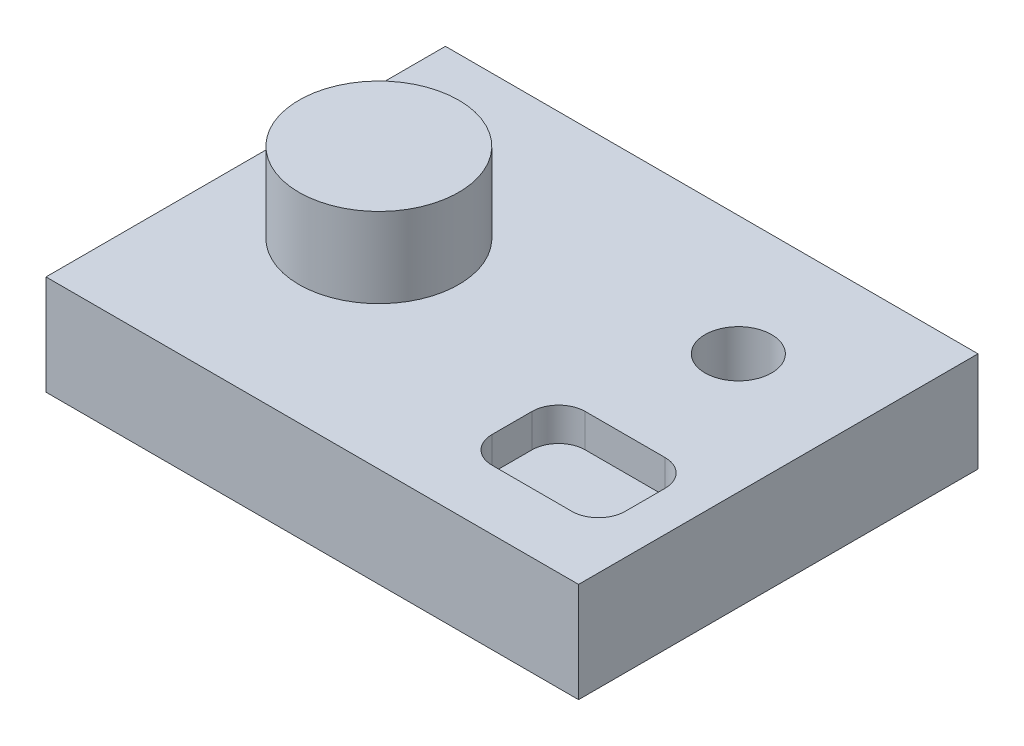
ISO-10303-21;
HEADER;
FILE_DESCRIPTION(('STEP AP214'),'2;1');
FILE_NAME('part.step','',(''),(''),'','','');
FILE_SCHEMA(('AUTOMOTIVE_DESIGN { 1 0 10303 214 1 1 1 1 }'));
ENDSEC;
DATA;
#1=APPLICATION_CONTEXT('core data for automotive mechanical design processes');
#2=APPLICATION_PROTOCOL_DEFINITION('international standard','automotive_design',2000,#1);
#3=PRODUCT_CONTEXT('',#1,'mechanical');
#4=PRODUCT('Part','Part','',(#3));
#5=PRODUCT_RELATED_PRODUCT_CATEGORY('part','',(#4));
#6=PRODUCT_DEFINITION_FORMATION('','',#4);
#7=PRODUCT_DEFINITION_CONTEXT('part definition',#1,'design');
#8=PRODUCT_DEFINITION('design','',#6,#7);
#9=PRODUCT_DEFINITION_SHAPE('','',#8);
#10=(LENGTH_UNIT() NAMED_UNIT(*) SI_UNIT(.MILLI.,.METRE.));
#11=(NAMED_UNIT(*) PLANE_ANGLE_UNIT() SI_UNIT($,.RADIAN.));
#12=(NAMED_UNIT(*) SI_UNIT($,.STERADIAN.) SOLID_ANGLE_UNIT());
#13=UNCERTAINTY_MEASURE_WITH_UNIT(LENGTH_MEASURE(1.E-05),#10,'distance_accuracy_value','');
#14=(GEOMETRIC_REPRESENTATION_CONTEXT(3) GLOBAL_UNCERTAINTY_ASSIGNED_CONTEXT((#13)) GLOBAL_UNIT_ASSIGNED_CONTEXT((#10,
#11,#12)) REPRESENTATION_CONTEXT('',''));
#15=CARTESIAN_POINT('',(0.,0.,0.));
#16=DIRECTION('',(0.,0.,1.));
#17=DIRECTION('',(1.,0.,0.));
#18=AXIS2_PLACEMENT_3D('',#15,#16,#17);
#19=CARTESIAN_POINT('',(-40.,15.,30.));
#20=DIRECTION('',(1.,0.,0.));
#21=DIRECTION('',(0.,0.,-1.));
#22=AXIS2_PLACEMENT_3D('',#19,#20,#21);
#23=PLANE('',#22);
#24=DIRECTION('',(0.,0.,1.));
#25=VECTOR('',#24,1.);
#26=CARTESIAN_POINT('',(-40.,0.,30.));
#27=LINE('',#26,#25);
#28=CARTESIAN_POINT('',(-40.,0.,-30.));
#29=VERTEX_POINT('',#28);
#30=CARTESIAN_POINT('',(-40.,0.,30.));
#31=VERTEX_POINT('',#30);
#32=EDGE_CURVE('E217',#29,#31,#27,.T.);
#33=ORIENTED_EDGE('',*,*,#32,.T.);
#34=DIRECTION('',(0.,-1.,0.));
#35=VECTOR('',#34,1.);
#36=CARTESIAN_POINT('',(-40.,15.,30.));
#37=LINE('',#36,#35);
#38=CARTESIAN_POINT('',(-40.,15.,30.));
#39=VERTEX_POINT('',#38);
#40=EDGE_CURVE('E42',#39,#31,#37,.T.);
#41=ORIENTED_EDGE('',*,*,#40,.F.);
#42=DIRECTION('',(0.,0.,1.));
#43=VECTOR('',#42,1.);
#44=CARTESIAN_POINT('',(-40.,15.,30.));
#45=LINE('',#44,#43);
#46=CARTESIAN_POINT('',(-40.,15.,-30.));
#47=VERTEX_POINT('',#46);
#48=EDGE_CURVE('E219',#47,#39,#45,.T.);
#49=ORIENTED_EDGE('',*,*,#48,.F.);
#50=DIRECTION('',(0.,-1.,0.));
#51=VECTOR('',#50,1.);
#52=CARTESIAN_POINT('',(-40.,15.,-30.));
#53=LINE('',#52,#51);
#54=EDGE_CURVE('E229',#47,#29,#53,.T.);
#55=ORIENTED_EDGE('',*,*,#54,.T.);
#56=EDGE_LOOP('',(#33,#41,#49,#55));
#57=FACE_BOUND('',#56,.T.);
#58=ADVANCED_FACE('F41',(#57),#23,.F.);
#59=CARTESIAN_POINT('',(-40.,15.,30.));
#60=DIRECTION('',(0.,0.,-1.));
#61=DIRECTION('',(-1.,0.,0.));
#62=AXIS2_PLACEMENT_3D('',#59,#60,#61);
#63=PLANE('',#62);
#64=DIRECTION('',(1.,0.,0.));
#65=VECTOR('',#64,1.);
#66=CARTESIAN_POINT('',(-40.,0.,30.));
#67=LINE('',#66,#65);
#68=CARTESIAN_POINT('',(40.,0.,30.));
#69=VERTEX_POINT('',#68);
#70=EDGE_CURVE('E228',#31,#69,#67,.T.);
#71=ORIENTED_EDGE('',*,*,#70,.T.);
#72=DIRECTION('',(0.,-1.,0.));
#73=VECTOR('',#72,1.);
#74=CARTESIAN_POINT('',(40.,15.,30.));
#75=LINE('',#74,#73);
#76=CARTESIAN_POINT('',(40.,15.,30.));
#77=VERTEX_POINT('',#76);
#78=EDGE_CURVE('E237',#77,#69,#75,.T.);
#79=ORIENTED_EDGE('',*,*,#78,.F.);
#80=DIRECTION('',(1.,0.,0.));
#81=VECTOR('',#80,1.);
#82=CARTESIAN_POINT('',(-40.,15.,30.));
#83=LINE('',#82,#81);
#84=EDGE_CURVE('E94',#39,#77,#83,.T.);
#85=ORIENTED_EDGE('',*,*,#84,.F.);
#86=ORIENTED_EDGE('',*,*,#40,.T.);
#87=EDGE_LOOP('',(#71,#79,#85,#86));
#88=FACE_BOUND('',#87,.T.);
#89=ADVANCED_FACE('F241',(#88),#63,.F.);
#90=CARTESIAN_POINT('',(40.,15.,30.));
#91=DIRECTION('',(-1.,0.,0.));
#92=DIRECTION('',(0.,0.,1.));
#93=AXIS2_PLACEMENT_3D('',#90,#91,#92);
#94=PLANE('',#93);
#95=DIRECTION('',(0.,0.,-1.));
#96=VECTOR('',#95,1.);
#97=CARTESIAN_POINT('',(40.,0.,30.));
#98=LINE('',#97,#96);
#99=CARTESIAN_POINT('',(40.,0.,-30.));
#100=VERTEX_POINT('',#99);
#101=EDGE_CURVE('E232',#69,#100,#98,.T.);
#102=ORIENTED_EDGE('',*,*,#101,.T.);
#103=DIRECTION('',(0.,-1.,0.));
#104=VECTOR('',#103,1.);
#105=CARTESIAN_POINT('',(40.,15.,-30.));
#106=LINE('',#105,#104);
#107=CARTESIAN_POINT('',(40.,15.,-30.));
#108=VERTEX_POINT('',#107);
#109=EDGE_CURVE('E231',#108,#100,#106,.T.);
#110=ORIENTED_EDGE('',*,*,#109,.F.);
#111=DIRECTION('',(0.,0.,-1.));
#112=VECTOR('',#111,1.);
#113=CARTESIAN_POINT('',(40.,15.,30.));
#114=LINE('',#113,#112);
#115=EDGE_CURVE('E224',#77,#108,#114,.T.);
#116=ORIENTED_EDGE('',*,*,#115,.F.);
#117=ORIENTED_EDGE('',*,*,#78,.T.);
#118=EDGE_LOOP('',(#102,#110,#116,#117));
#119=FACE_BOUND('',#118,.T.);
#120=ADVANCED_FACE('F249',(#119),#94,.F.);
#121=CARTESIAN_POINT('',(-40.,15.,-30.));
#122=DIRECTION('',(0.,0.,1.));
#123=DIRECTION('',(1.,0.,0.));
#124=AXIS2_PLACEMENT_3D('',#121,#122,#123);
#125=PLANE('',#124);
#126=DIRECTION('',(-1.,0.,0.));
#127=VECTOR('',#126,1.);
#128=CARTESIAN_POINT('',(-40.,0.,-30.));
#129=LINE('',#128,#127);
#130=EDGE_CURVE('E88',#100,#29,#129,.T.);
#131=ORIENTED_EDGE('',*,*,#130,.T.);
#132=ORIENTED_EDGE('',*,*,#54,.F.);
#133=DIRECTION('',(-1.,0.,0.));
#134=VECTOR('',#133,1.);
#135=CARTESIAN_POINT('',(-40.,15.,-30.));
#136=LINE('',#135,#134);
#137=EDGE_CURVE('E62',#108,#47,#136,.T.);
#138=ORIENTED_EDGE('',*,*,#137,.F.);
#139=ORIENTED_EDGE('',*,*,#109,.T.);
#140=EDGE_LOOP('',(#131,#132,#138,#139));
#141=FACE_BOUND('',#140,.T.);
#142=ADVANCED_FACE('F246',(#141),#125,.F.);
#143=CARTESIAN_POINT('',(0.,15.,0.));
#144=DIRECTION('',(0.,-1.,0.));
#145=DIRECTION('',(0.,0.,-1.));
#146=AXIS2_PLACEMENT_3D('',#143,#144,#145);
#147=PLANE('',#146);
#148=DIRECTION('',(1.,0.,0.));
#149=VECTOR('',#148,1.);
#150=CARTESIAN_POINT('',(18.,15.,21.));
#151=LINE('',#150,#149);
#152=CARTESIAN_POINT('',(18.,15.,21.));
#153=VERTEX_POINT('',#152);
#154=CARTESIAN_POINT('',(30.,15.,21.));
#155=VERTEX_POINT('',#154);
#156=EDGE_CURVE('E182',#153,#155,#151,.T.);
#157=ORIENTED_EDGE('',*,*,#156,.F.);
#158=CARTESIAN_POINT('',(18.,15.,17.));
#159=DIRECTION('',(0.,1.,0.));
#160=DIRECTION('',(0.,0.,1.));
#161=AXIS2_PLACEMENT_3D('',#158,#159,#160);
#162=CIRCLE('',#161,4.);
#163=CARTESIAN_POINT('',(14.,15.,17.));
#164=VERTEX_POINT('',#163);
#165=EDGE_CURVE('E57',#164,#153,#162,.T.);
#166=ORIENTED_EDGE('',*,*,#165,.F.);
#167=DIRECTION('',(0.,0.,1.));
#168=VECTOR('',#167,1.);
#169=CARTESIAN_POINT('',(14.,15.,11.));
#170=LINE('',#169,#168);
#171=CARTESIAN_POINT('',(14.,15.,11.));
#172=VERTEX_POINT('',#171);
#173=EDGE_CURVE('E161',#172,#164,#170,.T.);
#174=ORIENTED_EDGE('',*,*,#173,.F.);
#175=CARTESIAN_POINT('',(18.,15.,11.));
#176=DIRECTION('',(0.,1.,0.));
#177=DIRECTION('',(0.,0.,1.));
#178=AXIS2_PLACEMENT_3D('',#175,#176,#177);
#179=CIRCLE('',#178,4.);
#180=CARTESIAN_POINT('',(18.,15.,7.));
#181=VERTEX_POINT('',#180);
#182=EDGE_CURVE('E163',#181,#172,#179,.T.);
#183=ORIENTED_EDGE('',*,*,#182,.F.);
#184=DIRECTION('',(-1.,0.,0.));
#185=VECTOR('',#184,1.);
#186=CARTESIAN_POINT('',(30.,15.,7.));
#187=LINE('',#186,#185);
#188=CARTESIAN_POINT('',(30.,15.,7.));
#189=VERTEX_POINT('',#188);
#190=EDGE_CURVE('E195',#189,#181,#187,.T.);
#191=ORIENTED_EDGE('',*,*,#190,.F.);
#192=CARTESIAN_POINT('',(30.,15.,11.));
#193=DIRECTION('',(0.,1.,0.));
#194=DIRECTION('',(0.,0.,1.));
#195=AXIS2_PLACEMENT_3D('',#192,#193,#194);
#196=CIRCLE('',#195,4.);
#197=CARTESIAN_POINT('',(34.,15.,11.));
#198=VERTEX_POINT('',#197);
#199=EDGE_CURVE('E188',#198,#189,#196,.T.);
#200=ORIENTED_EDGE('',*,*,#199,.F.);
#201=DIRECTION('',(0.,0.,-1.));
#202=VECTOR('',#201,1.);
#203=CARTESIAN_POINT('',(34.,15.,17.));
#204=LINE('',#203,#202);
#205=CARTESIAN_POINT('',(34.,15.,17.));
#206=VERTEX_POINT('',#205);
#207=EDGE_CURVE('E189',#206,#198,#204,.T.);
#208=ORIENTED_EDGE('',*,*,#207,.F.);
#209=CARTESIAN_POINT('',(30.,15.,17.));
#210=DIRECTION('',(0.,1.,0.));
#211=DIRECTION('',(0.,0.,1.));
#212=AXIS2_PLACEMENT_3D('',#209,#210,#211);
#213=CIRCLE('',#212,4.);
#214=EDGE_CURVE('E181',#155,#206,#213,.T.);
#215=ORIENTED_EDGE('',*,*,#214,.F.);
#216=EDGE_LOOP('',(#157,#166,#174,#183,#191,#200,#208,#215));
#217=FACE_BOUND('',#216,.T.);
#218=CARTESIAN_POINT('',(22.,15.,-12.));
#219=DIRECTION('',(0.,1.,0.));
#220=DIRECTION('',(0.,0.,1.));
#221=AXIS2_PLACEMENT_3D('',#218,#219,#220);
#222=CIRCLE('',#221,5.);
#223=CARTESIAN_POINT('',(22.,15.,-7.));
#224=VERTEX_POINT('',#223);
#225=EDGE_CURVE('E200',#224,#224,#222,.T.);
#226=ORIENTED_EDGE('',*,*,#225,.F.);
#227=EDGE_LOOP('',(#226));
#228=FACE_BOUND('',#227,.T.);
#229=CARTESIAN_POINT('',(-20.,15.,0.));
#230=DIRECTION('',(0.,1.,0.));
#231=DIRECTION('',(0.,0.,1.));
#232=AXIS2_PLACEMENT_3D('',#229,#230,#231);
#233=CIRCLE('',#232,12.);
#234=CARTESIAN_POINT('',(-20.,15.,12.));
#235=VERTEX_POINT('',#234);
#236=EDGE_CURVE('E11',#235,#235,#233,.T.);
#237=ORIENTED_EDGE('',*,*,#236,.F.);
#238=EDGE_LOOP('',(#237));
#239=FACE_BOUND('',#238,.T.);
#240=ORIENTED_EDGE('',*,*,#48,.T.);
#241=ORIENTED_EDGE('',*,*,#84,.T.);
#242=ORIENTED_EDGE('',*,*,#115,.T.);
#243=ORIENTED_EDGE('',*,*,#137,.T.);
#244=EDGE_LOOP('',(#240,#241,#242,#243));
#245=FACE_BOUND('',#244,.T.);
#246=ADVANCED_FACE('F253',(#217,#228,#239,#245),#147,.F.);
#247=CARTESIAN_POINT('',(0.,0.,0.));
#248=DIRECTION('',(0.,-1.,0.));
#249=DIRECTION('',(0.,0.,-1.));
#250=AXIS2_PLACEMENT_3D('',#247,#248,#249);
#251=PLANE('',#250);
#252=ORIENTED_EDGE('',*,*,#32,.F.);
#253=ORIENTED_EDGE('',*,*,#130,.F.);
#254=ORIENTED_EDGE('',*,*,#101,.F.);
#255=ORIENTED_EDGE('',*,*,#70,.F.);
#256=EDGE_LOOP('',(#252,#253,#254,#255));
#257=FACE_BOUND('',#256,.T.);
#258=ADVANCED_FACE('F250',(#257),#251,.T.);
#259=CARTESIAN_POINT('',(-20.,27.,0.));
#260=DIRECTION('',(0.,-1.,0.));
#261=DIRECTION('',(0.,0.,-1.));
#262=AXIS2_PLACEMENT_3D('',#259,#260,#261);
#263=CYLINDRICAL_SURFACE('',#262,12.);
#264=CARTESIAN_POINT('',(-20.,27.,0.));
#265=DIRECTION('',(0.,1.,0.));
#266=DIRECTION('',(0.,0.,1.));
#267=AXIS2_PLACEMENT_3D('',#264,#265,#266);
#268=CIRCLE('',#267,12.);
#269=CARTESIAN_POINT('',(-20.,27.,12.));
#270=VERTEX_POINT('',#269);
#271=EDGE_CURVE('E212',#270,#270,#268,.T.);
#272=ORIENTED_EDGE('',*,*,#271,.F.);
#273=EDGE_LOOP('',(#272));
#274=FACE_BOUND('',#273,.T.);
#275=ORIENTED_EDGE('',*,*,#236,.T.);
#276=EDGE_LOOP('',(#275));
#277=FACE_BOUND('',#276,.T.);
#278=ADVANCED_FACE('F257',(#274,#277),#263,.T.);
#279=CARTESIAN_POINT('',(-20.,27.,0.));
#280=DIRECTION('',(0.,1.,0.));
#281=DIRECTION('',(0.,0.,1.));
#282=AXIS2_PLACEMENT_3D('',#279,#280,#281);
#283=PLANE('',#282);
#284=ORIENTED_EDGE('',*,*,#271,.T.);
#285=EDGE_LOOP('',(#284));
#286=FACE_BOUND('',#285,.T.);
#287=ADVANCED_FACE('F291',(#286),#283,.T.);
#288=CARTESIAN_POINT('',(22.,5.,-12.));
#289=DIRECTION('',(0.,1.,0.));
#290=DIRECTION('',(0.,0.,1.));
#291=AXIS2_PLACEMENT_3D('',#288,#289,#290);
#292=CYLINDRICAL_SURFACE('',#291,5.);
#293=CARTESIAN_POINT('',(22.,5.,-12.));
#294=DIRECTION('',(0.,1.,0.));
#295=DIRECTION('',(0.,0.,1.));
#296=AXIS2_PLACEMENT_3D('',#293,#294,#295);
#297=CIRCLE('',#296,5.);
#298=CARTESIAN_POINT('',(22.,5.,-7.));
#299=VERTEX_POINT('',#298);
#300=EDGE_CURVE('E211',#299,#299,#297,.T.);
#301=ORIENTED_EDGE('',*,*,#300,.F.);
#302=EDGE_LOOP('',(#301));
#303=FACE_BOUND('',#302,.T.);
#304=ORIENTED_EDGE('',*,*,#225,.T.);
#305=EDGE_LOOP('',(#304));
#306=FACE_BOUND('',#305,.T.);
#307=ADVANCED_FACE('F302',(#303,#306),#292,.F.);
#308=CARTESIAN_POINT('',(22.,5.,-12.));
#309=DIRECTION('',(0.,1.,0.));
#310=DIRECTION('',(0.,0.,1.));
#311=AXIS2_PLACEMENT_3D('',#308,#309,#310);
#312=PLANE('',#311);
#313=ORIENTED_EDGE('',*,*,#300,.T.);
#314=EDGE_LOOP('',(#313));
#315=FACE_BOUND('',#314,.T.);
#316=ADVANCED_FACE('F310',(#315),#312,.T.);
#317=CARTESIAN_POINT('',(18.,10.,17.));
#318=DIRECTION('',(0.,1.,0.));
#319=DIRECTION('',(0.,0.,1.));
#320=AXIS2_PLACEMENT_3D('',#317,#318,#319);
#321=CYLINDRICAL_SURFACE('',#320,4.);
#322=ORIENTED_EDGE('',*,*,#165,.T.);
#323=DIRECTION('',(0.,1.,0.));
#324=VECTOR('',#323,1.);
#325=CARTESIAN_POINT('',(18.,10.,21.));
#326=LINE('',#325,#324);
#327=CARTESIAN_POINT('',(18.,10.,21.));
#328=VERTEX_POINT('',#327);
#329=EDGE_CURVE('E138',#328,#153,#326,.T.);
#330=ORIENTED_EDGE('',*,*,#329,.F.);
#331=CARTESIAN_POINT('',(18.,10.,17.));
#332=DIRECTION('',(0.,1.,0.));
#333=DIRECTION('',(0.,0.,1.));
#334=AXIS2_PLACEMENT_3D('',#331,#332,#333);
#335=CIRCLE('',#334,4.);
#336=CARTESIAN_POINT('',(14.,10.,17.));
#337=VERTEX_POINT('',#336);
#338=EDGE_CURVE('E142',#337,#328,#335,.T.);
#339=ORIENTED_EDGE('',*,*,#338,.F.);
#340=DIRECTION('',(0.,1.,0.));
#341=VECTOR('',#340,1.);
#342=CARTESIAN_POINT('',(14.,10.,17.));
#343=LINE('',#342,#341);
#344=EDGE_CURVE('E197',#337,#164,#343,.T.);
#345=ORIENTED_EDGE('',*,*,#344,.T.);
#346=EDGE_LOOP('',(#322,#330,#339,#345));
#347=FACE_BOUND('',#346,.T.);
#348=ADVANCED_FACE('F136',(#347),#321,.F.);
#349=CARTESIAN_POINT('',(14.,10.,11.));
#350=DIRECTION('',(-1.,0.,0.));
#351=DIRECTION('',(0.,0.,1.));
#352=AXIS2_PLACEMENT_3D('',#349,#350,#351);
#353=PLANE('',#352);
#354=ORIENTED_EDGE('',*,*,#173,.T.);
#355=ORIENTED_EDGE('',*,*,#344,.F.);
#356=DIRECTION('',(0.,0.,1.));
#357=VECTOR('',#356,1.);
#358=CARTESIAN_POINT('',(14.,10.,11.));
#359=LINE('',#358,#357);
#360=CARTESIAN_POINT('',(14.,10.,11.));
#361=VERTEX_POINT('',#360);
#362=EDGE_CURVE('E146',#361,#337,#359,.T.);
#363=ORIENTED_EDGE('',*,*,#362,.F.);
#364=DIRECTION('',(0.,1.,0.));
#365=VECTOR('',#364,1.);
#366=CARTESIAN_POINT('',(14.,10.,11.));
#367=LINE('',#366,#365);
#368=EDGE_CURVE('E199',#361,#172,#367,.T.);
#369=ORIENTED_EDGE('',*,*,#368,.T.);
#370=EDGE_LOOP('',(#354,#355,#363,#369));
#371=FACE_BOUND('',#370,.T.);
#372=ADVANCED_FACE('F327',(#371),#353,.F.);
#373=CARTESIAN_POINT('',(18.,10.,11.));
#374=DIRECTION('',(0.,1.,0.));
#375=DIRECTION('',(0.,0.,1.));
#376=AXIS2_PLACEMENT_3D('',#373,#374,#375);
#377=CYLINDRICAL_SURFACE('',#376,4.);
#378=ORIENTED_EDGE('',*,*,#182,.T.);
#379=ORIENTED_EDGE('',*,*,#368,.F.);
#380=CARTESIAN_POINT('',(18.,10.,11.));
#381=DIRECTION('',(0.,1.,0.));
#382=DIRECTION('',(0.,0.,1.));
#383=AXIS2_PLACEMENT_3D('',#380,#381,#382);
#384=CIRCLE('',#383,4.);
#385=CARTESIAN_POINT('',(18.,10.,7.));
#386=VERTEX_POINT('',#385);
#387=EDGE_CURVE('E180',#386,#361,#384,.T.);
#388=ORIENTED_EDGE('',*,*,#387,.F.);
#389=DIRECTION('',(0.,1.,0.));
#390=VECTOR('',#389,1.);
#391=CARTESIAN_POINT('',(18.,10.,7.));
#392=LINE('',#391,#390);
#393=EDGE_CURVE('E205',#386,#181,#392,.T.);
#394=ORIENTED_EDGE('',*,*,#393,.T.);
#395=EDGE_LOOP('',(#378,#379,#388,#394));
#396=FACE_BOUND('',#395,.T.);
#397=ADVANCED_FACE('F336',(#396),#377,.F.);
#398=CARTESIAN_POINT('',(30.,10.,7.));
#399=DIRECTION('',(0.,0.,-1.));
#400=DIRECTION('',(-1.,0.,0.));
#401=AXIS2_PLACEMENT_3D('',#398,#399,#400);
#402=PLANE('',#401);
#403=ORIENTED_EDGE('',*,*,#190,.T.);
#404=ORIENTED_EDGE('',*,*,#393,.F.);
#405=DIRECTION('',(-1.,0.,0.));
#406=VECTOR('',#405,1.);
#407=CARTESIAN_POINT('',(30.,10.,7.));
#408=LINE('',#407,#406);
#409=CARTESIAN_POINT('',(30.,10.,7.));
#410=VERTEX_POINT('',#409);
#411=EDGE_CURVE('E173',#410,#386,#408,.T.);
#412=ORIENTED_EDGE('',*,*,#411,.F.);
#413=DIRECTION('',(0.,1.,0.));
#414=VECTOR('',#413,1.);
#415=CARTESIAN_POINT('',(30.,10.,7.));
#416=LINE('',#415,#414);
#417=EDGE_CURVE('E204',#410,#189,#416,.T.);
#418=ORIENTED_EDGE('',*,*,#417,.T.);
#419=EDGE_LOOP('',(#403,#404,#412,#418));
#420=FACE_BOUND('',#419,.T.);
#421=ADVANCED_FACE('F350',(#420),#402,.F.);
#422=CARTESIAN_POINT('',(30.,10.,11.));
#423=DIRECTION('',(0.,1.,0.));
#424=DIRECTION('',(0.,0.,1.));
#425=AXIS2_PLACEMENT_3D('',#422,#423,#424);
#426=CYLINDRICAL_SURFACE('',#425,4.);
#427=ORIENTED_EDGE('',*,*,#199,.T.);
#428=ORIENTED_EDGE('',*,*,#417,.F.);
#429=CARTESIAN_POINT('',(30.,10.,11.));
#430=DIRECTION('',(0.,1.,0.));
#431=DIRECTION('',(0.,0.,1.));
#432=AXIS2_PLACEMENT_3D('',#429,#430,#431);
#433=CIRCLE('',#432,4.);
#434=CARTESIAN_POINT('',(34.,10.,11.));
#435=VERTEX_POINT('',#434);
#436=EDGE_CURVE('E174',#435,#410,#433,.T.);
#437=ORIENTED_EDGE('',*,*,#436,.F.);
#438=DIRECTION('',(0.,1.,0.));
#439=VECTOR('',#438,1.);
#440=CARTESIAN_POINT('',(34.,10.,11.));
#441=LINE('',#440,#439);
#442=EDGE_CURVE('E206',#435,#198,#441,.T.);
#443=ORIENTED_EDGE('',*,*,#442,.T.);
#444=EDGE_LOOP('',(#427,#428,#437,#443));
#445=FACE_BOUND('',#444,.T.);
#446=ADVANCED_FACE('F360',(#445),#426,.F.);
#447=CARTESIAN_POINT('',(34.,10.,17.));
#448=DIRECTION('',(1.,0.,0.));
#449=DIRECTION('',(0.,0.,-1.));
#450=AXIS2_PLACEMENT_3D('',#447,#448,#449);
#451=PLANE('',#450);
#452=ORIENTED_EDGE('',*,*,#207,.T.);
#453=ORIENTED_EDGE('',*,*,#442,.F.);
#454=DIRECTION('',(0.,0.,-1.));
#455=VECTOR('',#454,1.);
#456=CARTESIAN_POINT('',(34.,10.,17.));
#457=LINE('',#456,#455);
#458=CARTESIAN_POINT('',(34.,10.,17.));
#459=VERTEX_POINT('',#458);
#460=EDGE_CURVE('E169',#459,#435,#457,.T.);
#461=ORIENTED_EDGE('',*,*,#460,.F.);
#462=DIRECTION('',(0.,1.,0.));
#463=VECTOR('',#462,1.);
#464=CARTESIAN_POINT('',(34.,10.,17.));
#465=LINE('',#464,#463);
#466=EDGE_CURVE('E208',#459,#206,#465,.T.);
#467=ORIENTED_EDGE('',*,*,#466,.T.);
#468=EDGE_LOOP('',(#452,#453,#461,#467));
#469=FACE_BOUND('',#468,.T.);
#470=ADVANCED_FACE('F370',(#469),#451,.F.);
#471=CARTESIAN_POINT('',(30.,10.,17.));
#472=DIRECTION('',(0.,1.,0.));
#473=DIRECTION('',(0.,0.,1.));
#474=AXIS2_PLACEMENT_3D('',#471,#472,#473);
#475=CYLINDRICAL_SURFACE('',#474,4.);
#476=ORIENTED_EDGE('',*,*,#214,.T.);
#477=ORIENTED_EDGE('',*,*,#466,.F.);
#478=CARTESIAN_POINT('',(30.,10.,17.));
#479=DIRECTION('',(0.,1.,0.));
#480=DIRECTION('',(0.,0.,1.));
#481=AXIS2_PLACEMENT_3D('',#478,#479,#480);
#482=CIRCLE('',#481,4.);
#483=CARTESIAN_POINT('',(30.,10.,21.));
#484=VERTEX_POINT('',#483);
#485=EDGE_CURVE('E156',#484,#459,#482,.T.);
#486=ORIENTED_EDGE('',*,*,#485,.F.);
#487=DIRECTION('',(0.,1.,0.));
#488=VECTOR('',#487,1.);
#489=CARTESIAN_POINT('',(30.,10.,21.));
#490=LINE('',#489,#488);
#491=EDGE_CURVE('E150',#484,#155,#490,.T.);
#492=ORIENTED_EDGE('',*,*,#491,.T.);
#493=EDGE_LOOP('',(#476,#477,#486,#492));
#494=FACE_BOUND('',#493,.T.);
#495=ADVANCED_FACE('F380',(#494),#475,.F.);
#496=CARTESIAN_POINT('',(18.,10.,21.));
#497=DIRECTION('',(0.,0.,1.));
#498=DIRECTION('',(1.,0.,0.));
#499=AXIS2_PLACEMENT_3D('',#496,#497,#498);
#500=PLANE('',#499);
#501=ORIENTED_EDGE('',*,*,#156,.T.);
#502=ORIENTED_EDGE('',*,*,#491,.F.);
#503=DIRECTION('',(1.,0.,0.));
#504=VECTOR('',#503,1.);
#505=CARTESIAN_POINT('',(18.,10.,21.));
#506=LINE('',#505,#504);
#507=EDGE_CURVE('E151',#328,#484,#506,.T.);
#508=ORIENTED_EDGE('',*,*,#507,.F.);
#509=ORIENTED_EDGE('',*,*,#329,.T.);
#510=EDGE_LOOP('',(#501,#502,#508,#509));
#511=FACE_BOUND('',#510,.T.);
#512=ADVANCED_FACE('F155',(#511),#500,.F.);
#513=CARTESIAN_POINT('',(18.,10.,17.));
#514=DIRECTION('',(0.,1.,0.));
#515=DIRECTION('',(0.,0.,1.));
#516=AXIS2_PLACEMENT_3D('',#513,#514,#515);
#517=PLANE('',#516);
#518=ORIENTED_EDGE('',*,*,#338,.T.);
#519=ORIENTED_EDGE('',*,*,#507,.T.);
#520=ORIENTED_EDGE('',*,*,#485,.T.);
#521=ORIENTED_EDGE('',*,*,#460,.T.);
#522=ORIENTED_EDGE('',*,*,#436,.T.);
#523=ORIENTED_EDGE('',*,*,#411,.T.);
#524=ORIENTED_EDGE('',*,*,#387,.T.);
#525=ORIENTED_EDGE('',*,*,#362,.T.);
#526=EDGE_LOOP('',(#518,#519,#520,#521,#522,#523,#524,#525));
#527=FACE_BOUND('',#526,.T.);
#528=ADVANCED_FACE('F158',(#527),#517,.T.);
#529=CLOSED_SHELL('',(#58,#89,#120,#142,#246,#258,#278,#287,#307,#316,#348,#372,#397,#421,#446,
#470,#495,#512,#528));
#530=MANIFOLD_SOLID_BREP('B2',#529);
#531=ADVANCED_BREP_SHAPE_REPRESENTATION('',(#18,#530),#14);
#532=SHAPE_DEFINITION_REPRESENTATION(#9,#531);
ENDSEC;
END-ISO-10303-21;
